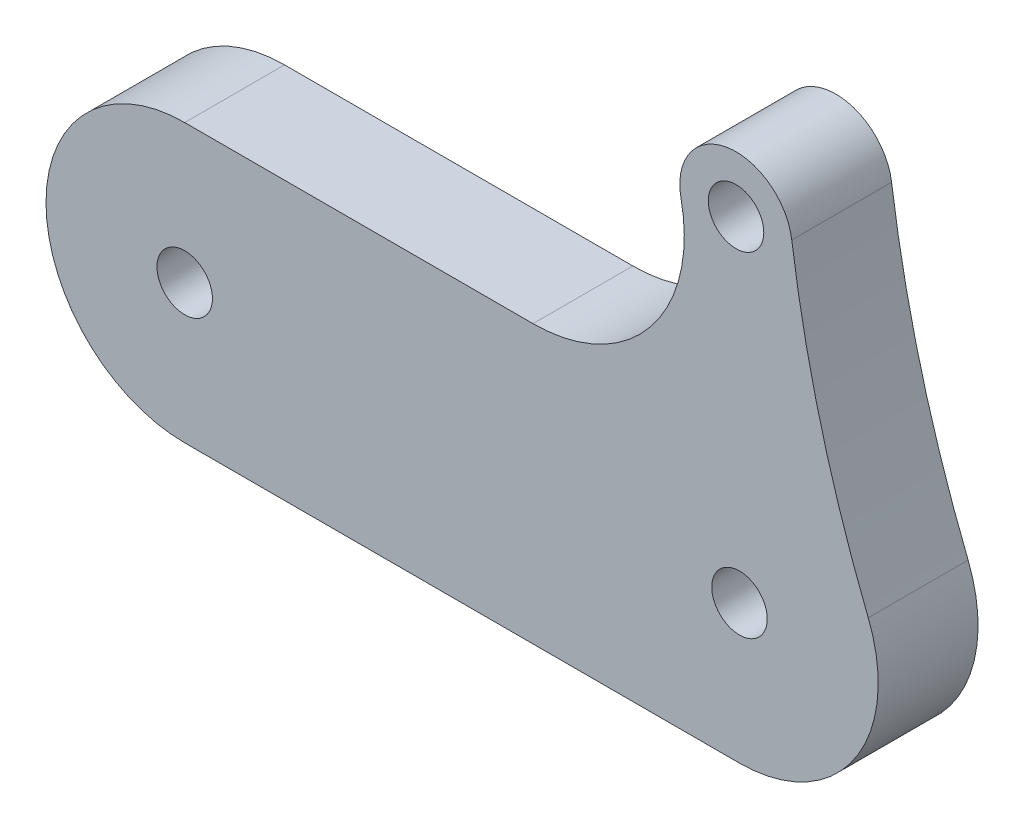
ISO-10303-21;
HEADER;
FILE_DESCRIPTION(('STEP AP214'),'2;1');
FILE_NAME('part.step','',(''),(''),'','','');
FILE_SCHEMA(('AUTOMOTIVE_DESIGN { 1 0 10303 214 1 1 1 1 }'));
ENDSEC;
DATA;
#1=APPLICATION_CONTEXT('core data for automotive mechanical design processes');
#2=APPLICATION_PROTOCOL_DEFINITION('international standard','automotive_design',2000,#1);
#3=PRODUCT_CONTEXT('',#1,'mechanical');
#4=PRODUCT('Part','Part','',(#3));
#5=PRODUCT_RELATED_PRODUCT_CATEGORY('part','',(#4));
#6=PRODUCT_DEFINITION_FORMATION('','',#4);
#7=PRODUCT_DEFINITION_CONTEXT('part definition',#1,'design');
#8=PRODUCT_DEFINITION('design','',#6,#7);
#9=PRODUCT_DEFINITION_SHAPE('','',#8);
#10=(LENGTH_UNIT() NAMED_UNIT(*) SI_UNIT(.MILLI.,.METRE.));
#11=(NAMED_UNIT(*) PLANE_ANGLE_UNIT() SI_UNIT($,.RADIAN.));
#12=(NAMED_UNIT(*) SI_UNIT($,.STERADIAN.) SOLID_ANGLE_UNIT());
#13=UNCERTAINTY_MEASURE_WITH_UNIT(LENGTH_MEASURE(1.E-05),#10,'distance_accuracy_value','');
#14=(GEOMETRIC_REPRESENTATION_CONTEXT(3) GLOBAL_UNCERTAINTY_ASSIGNED_CONTEXT((#13)) GLOBAL_UNIT_ASSIGNED_CONTEXT((#10,
#11,#12)) REPRESENTATION_CONTEXT('',''));
#15=CARTESIAN_POINT('',(0.,0.,0.));
#16=DIRECTION('',(0.,0.,1.));
#17=DIRECTION('',(1.,0.,0.));
#18=AXIS2_PLACEMENT_3D('',#15,#16,#17);
#19=CARTESIAN_POINT('',(0.,0.,3.6));
#20=DIRECTION('',(0.,0.,1.));
#21=DIRECTION('',(1.,0.,0.));
#22=AXIS2_PLACEMENT_3D('',#19,#20,#21);
#23=PLANE('',#22);
#24=CARTESIAN_POINT('',(20.,0.,3.6));
#25=DIRECTION('',(0.,0.,1.));
#26=DIRECTION('',(1.,0.,0.));
#27=AXIS2_PLACEMENT_3D('',#24,#25,#26);
#28=CIRCLE('',#27,1.);
#29=CARTESIAN_POINT('',(21.,0.,3.6));
#30=VERTEX_POINT('',#29);
#31=EDGE_CURVE('E163',#30,#30,#28,.T.);
#32=ORIENTED_EDGE('',*,*,#31,.F.);
#33=EDGE_LOOP('',(#32));
#34=FACE_BOUND('',#33,.T.);
#35=CARTESIAN_POINT('',(0.,0.,3.6));
#36=DIRECTION('',(0.,0.,1.));
#37=DIRECTION('',(1.,0.,0.));
#38=AXIS2_PLACEMENT_3D('',#35,#36,#37);
#39=CIRCLE('',#38,5.);
#40=CARTESIAN_POINT('',(0.,5.,3.6));
#41=VERTEX_POINT('',#40);
#42=CARTESIAN_POINT('',(0.,-5.,3.6));
#43=VERTEX_POINT('',#42);
#44=EDGE_CURVE('E136',#41,#43,#39,.T.);
#45=ORIENTED_EDGE('',*,*,#44,.T.);
#46=DIRECTION('',(1.,0.,0.));
#47=VECTOR('',#46,1.);
#48=CARTESIAN_POINT('',(0.,-5.,3.6));
#49=LINE('',#48,#47);
#50=CARTESIAN_POINT('',(20.,-4.99999999999999,3.6));
#51=VERTEX_POINT('',#50);
#52=EDGE_CURVE('E89',#43,#51,#49,.T.);
#53=ORIENTED_EDGE('',*,*,#52,.T.);
#54=CARTESIAN_POINT('',(20.,0.,3.6));
#55=DIRECTION('',(0.,0.,1.));
#56=DIRECTION('',(1.,0.,0.));
#57=AXIS2_PLACEMENT_3D('',#54,#55,#56);
#58=CIRCLE('',#57,4.99999999999999);
#59=CARTESIAN_POINT('',(24.6411364192931,1.86006793895037,3.6));
#60=VERTEX_POINT('',#59);
#61=EDGE_CURVE('E148',#51,#60,#58,.T.);
#62=ORIENTED_EDGE('',*,*,#61,.T.);
#63=CARTESIAN_POINT('',(65.610052843206,18.2795309861631,3.6));
#64=DIRECTION('',(0.,0.,-1.));
#65=DIRECTION('',(1.,0.,0.));
#66=AXIS2_PLACEMENT_3D('',#63,#64,#65);
#67=CIRCLE('',#66,44.1367293725798);
#68=CARTESIAN_POINT('',(21.883567401075,12.2757529599989,3.6));
#69=VERTEX_POINT('',#68);
#70=EDGE_CURVE('E105',#60,#69,#67,.T.);
#71=ORIENTED_EDGE('',*,*,#70,.T.);
#72=CARTESIAN_POINT('',(19.8752140377203,11.9999999999848,3.6));
#73=DIRECTION('',(0.,0.,1.));
#74=DIRECTION('',(1.,0.,0.));
#75=AXIS2_PLACEMENT_3D('',#72,#73,#74);
#76=CIRCLE('',#75,2.02719582849183);
#77=CARTESIAN_POINT('',(17.8918522278178,11.5807162558749,3.6));
#78=VERTEX_POINT('',#77);
#79=EDGE_CURVE('E99',#69,#78,#76,.T.);
#80=ORIENTED_EDGE('',*,*,#79,.T.);
#81=CARTESIAN_POINT('',(12.5568633524244,10.4528967630869,3.6));
#82=DIRECTION('',(0.,0.,-1.));
#83=DIRECTION('',(1.,0.,0.));
#84=AXIS2_PLACEMENT_3D('',#81,#82,#83);
#85=CIRCLE('',#84,5.45289676308689);
#86=CARTESIAN_POINT('',(12.5568633524244,5.,3.6));
#87=VERTEX_POINT('',#86);
#88=EDGE_CURVE('E103',#78,#87,#85,.T.);
#89=ORIENTED_EDGE('',*,*,#88,.T.);
#90=DIRECTION('',(-1.,0.,0.));
#91=VECTOR('',#90,1.);
#92=CARTESIAN_POINT('',(0.,5.,3.6));
#93=LINE('',#92,#91);
#94=EDGE_CURVE('E49',#87,#41,#93,.T.);
#95=ORIENTED_EDGE('',*,*,#94,.T.);
#96=EDGE_LOOP('',(#45,#53,#62,#71,#80,#89,#95));
#97=FACE_BOUND('',#96,.T.);
#98=CARTESIAN_POINT('',(0.,0.,3.6));
#99=DIRECTION('',(0.,0.,1.));
#100=DIRECTION('',(1.,0.,0.));
#101=AXIS2_PLACEMENT_3D('',#98,#99,#100);
#102=CIRCLE('',#101,1.);
#103=CARTESIAN_POINT('',(1.,0.,3.6));
#104=VERTEX_POINT('',#103);
#105=EDGE_CURVE('E127',#104,#104,#102,.T.);
#106=ORIENTED_EDGE('',*,*,#105,.F.);
#107=EDGE_LOOP('',(#106));
#108=FACE_BOUND('',#107,.T.);
#109=CARTESIAN_POINT('',(19.8752140377203,11.9999999999848,3.6));
#110=DIRECTION('',(0.,0.,1.));
#111=DIRECTION('',(1.,0.,0.));
#112=AXIS2_PLACEMENT_3D('',#109,#110,#111);
#113=CIRCLE('',#112,1.);
#114=CARTESIAN_POINT('',(20.8752140377203,11.9999999999848,3.6));
#115=VERTEX_POINT('',#114);
#116=EDGE_CURVE('E169',#115,#115,#113,.T.);
#117=ORIENTED_EDGE('',*,*,#116,.F.);
#118=EDGE_LOOP('',(#117));
#119=FACE_BOUND('',#118,.T.);
#120=ADVANCED_FACE('F32',(#34,#97,#108,#119),#23,.T.);
#121=CARTESIAN_POINT('',(0.,0.,0.));
#122=DIRECTION('',(0.,0.,1.));
#123=DIRECTION('',(1.,0.,0.));
#124=AXIS2_PLACEMENT_3D('',#121,#122,#123);
#125=PLANE('',#124);
#126=CARTESIAN_POINT('',(0.,0.,0.));
#127=DIRECTION('',(0.,0.,1.));
#128=DIRECTION('',(1.,0.,0.));
#129=AXIS2_PLACEMENT_3D('',#126,#127,#128);
#130=CIRCLE('',#129,5.);
#131=CARTESIAN_POINT('',(0.,5.,0.));
#132=VERTEX_POINT('',#131);
#133=CARTESIAN_POINT('',(0.,-5.,0.));
#134=VERTEX_POINT('',#133);
#135=EDGE_CURVE('E123',#132,#134,#130,.T.);
#136=ORIENTED_EDGE('',*,*,#135,.F.);
#137=DIRECTION('',(-1.,0.,0.));
#138=VECTOR('',#137,1.);
#139=CARTESIAN_POINT('',(0.,5.,0.));
#140=LINE('',#139,#138);
#141=CARTESIAN_POINT('',(12.5568633524244,5.,0.));
#142=VERTEX_POINT('',#141);
#143=EDGE_CURVE('E81',#142,#132,#140,.T.);
#144=ORIENTED_EDGE('',*,*,#143,.F.);
#145=CARTESIAN_POINT('',(12.5568633524244,10.4528967630869,0.));
#146=DIRECTION('',(0.,0.,-1.));
#147=DIRECTION('',(1.,0.,0.));
#148=AXIS2_PLACEMENT_3D('',#145,#146,#147);
#149=CIRCLE('',#148,5.45289676308689);
#150=CARTESIAN_POINT('',(17.8918522278178,11.5807162558749,0.));
#151=VERTEX_POINT('',#150);
#152=EDGE_CURVE('E75',#151,#142,#149,.T.);
#153=ORIENTED_EDGE('',*,*,#152,.F.);
#154=CARTESIAN_POINT('',(19.8752140377203,11.9999999999848,0.));
#155=DIRECTION('',(0.,0.,1.));
#156=DIRECTION('',(1.,0.,0.));
#157=AXIS2_PLACEMENT_3D('',#154,#155,#156);
#158=CIRCLE('',#157,2.02719582849183);
#159=CARTESIAN_POINT('',(21.883567401075,12.2757529599989,0.));
#160=VERTEX_POINT('',#159);
#161=EDGE_CURVE('E113',#160,#151,#158,.T.);
#162=ORIENTED_EDGE('',*,*,#161,.F.);
#163=CARTESIAN_POINT('',(65.610052843206,18.2795309861631,0.));
#164=DIRECTION('',(0.,0.,-1.));
#165=DIRECTION('',(1.,0.,0.));
#166=AXIS2_PLACEMENT_3D('',#163,#164,#165);
#167=CIRCLE('',#166,44.1367293725798);
#168=CARTESIAN_POINT('',(24.6411364192931,1.86006793895037,0.));
#169=VERTEX_POINT('',#168);
#170=EDGE_CURVE('E131',#169,#160,#167,.T.);
#171=ORIENTED_EDGE('',*,*,#170,.F.);
#172=CARTESIAN_POINT('',(20.,0.,0.));
#173=DIRECTION('',(0.,0.,1.));
#174=DIRECTION('',(1.,0.,0.));
#175=AXIS2_PLACEMENT_3D('',#172,#173,#174);
#176=CIRCLE('',#175,4.99999999999999);
#177=CARTESIAN_POINT('',(20.,-4.99999999999999,0.));
#178=VERTEX_POINT('',#177);
#179=EDGE_CURVE('E129',#178,#169,#176,.T.);
#180=ORIENTED_EDGE('',*,*,#179,.F.);
#181=DIRECTION('',(1.,0.,0.));
#182=VECTOR('',#181,1.);
#183=CARTESIAN_POINT('',(0.,-5.,0.));
#184=LINE('',#183,#182);
#185=EDGE_CURVE('E126',#134,#178,#184,.T.);
#186=ORIENTED_EDGE('',*,*,#185,.F.);
#187=EDGE_LOOP('',(#136,#144,#153,#162,#171,#180,#186));
#188=FACE_BOUND('',#187,.T.);
#189=CARTESIAN_POINT('',(0.,0.,0.));
#190=DIRECTION('',(0.,0.,1.));
#191=DIRECTION('',(1.,0.,0.));
#192=AXIS2_PLACEMENT_3D('',#189,#190,#191);
#193=CIRCLE('',#192,1.);
#194=CARTESIAN_POINT('',(1.,0.,0.));
#195=VERTEX_POINT('',#194);
#196=EDGE_CURVE('E160',#195,#195,#193,.T.);
#197=ORIENTED_EDGE('',*,*,#196,.T.);
#198=EDGE_LOOP('',(#197));
#199=FACE_BOUND('',#198,.T.);
#200=CARTESIAN_POINT('',(20.,0.,0.));
#201=DIRECTION('',(0.,0.,1.));
#202=DIRECTION('',(1.,0.,0.));
#203=AXIS2_PLACEMENT_3D('',#200,#201,#202);
#204=CIRCLE('',#203,1.);
#205=CARTESIAN_POINT('',(21.,0.,0.));
#206=VERTEX_POINT('',#205);
#207=EDGE_CURVE('E166',#206,#206,#204,.T.);
#208=ORIENTED_EDGE('',*,*,#207,.T.);
#209=EDGE_LOOP('',(#208));
#210=FACE_BOUND('',#209,.T.);
#211=CARTESIAN_POINT('',(19.8752140377203,11.9999999999848,0.));
#212=DIRECTION('',(0.,0.,1.));
#213=DIRECTION('',(1.,0.,0.));
#214=AXIS2_PLACEMENT_3D('',#211,#212,#213);
#215=CIRCLE('',#214,1.);
#216=CARTESIAN_POINT('',(20.8752140377203,11.9999999999848,0.));
#217=VERTEX_POINT('',#216);
#218=EDGE_CURVE('E172',#217,#217,#215,.T.);
#219=ORIENTED_EDGE('',*,*,#218,.T.);
#220=EDGE_LOOP('',(#219));
#221=FACE_BOUND('',#220,.T.);
#222=ADVANCED_FACE('F152',(#188,#199,#210,#221),#125,.F.);
#223=CARTESIAN_POINT('',(0.,0.,3.6));
#224=DIRECTION('',(0.,0.,-1.));
#225=DIRECTION('',(-1.,0.,0.));
#226=AXIS2_PLACEMENT_3D('',#223,#224,#225);
#227=CYLINDRICAL_SURFACE('',#226,5.);
#228=ORIENTED_EDGE('',*,*,#135,.T.);
#229=DIRECTION('',(0.,0.,-1.));
#230=VECTOR('',#229,1.);
#231=CARTESIAN_POINT('',(0.,-5.,3.6));
#232=LINE('',#231,#230);
#233=EDGE_CURVE('E11',#43,#134,#232,.T.);
#234=ORIENTED_EDGE('',*,*,#233,.F.);
#235=ORIENTED_EDGE('',*,*,#44,.F.);
#236=DIRECTION('',(0.,0.,-1.));
#237=VECTOR('',#236,1.);
#238=CARTESIAN_POINT('',(0.,5.,3.6));
#239=LINE('',#238,#237);
#240=EDGE_CURVE('E119',#41,#132,#239,.T.);
#241=ORIENTED_EDGE('',*,*,#240,.T.);
#242=EDGE_LOOP('',(#228,#234,#235,#241));
#243=FACE_BOUND('',#242,.T.);
#244=ADVANCED_FACE('F34',(#243),#227,.T.);
#245=CARTESIAN_POINT('',(0.,-5.,3.6));
#246=DIRECTION('',(0.,1.,0.));
#247=DIRECTION('',(-1.,0.,0.));
#248=AXIS2_PLACEMENT_3D('',#245,#246,#247);
#249=PLANE('',#248);
#250=ORIENTED_EDGE('',*,*,#185,.T.);
#251=DIRECTION('',(0.,0.,-1.));
#252=VECTOR('',#251,1.);
#253=CARTESIAN_POINT('',(20.,-4.99999999999999,3.6));
#254=LINE('',#253,#252);
#255=EDGE_CURVE('E41',#51,#178,#254,.T.);
#256=ORIENTED_EDGE('',*,*,#255,.F.);
#257=ORIENTED_EDGE('',*,*,#52,.F.);
#258=ORIENTED_EDGE('',*,*,#233,.T.);
#259=EDGE_LOOP('',(#250,#256,#257,#258));
#260=FACE_BOUND('',#259,.T.);
#261=ADVANCED_FACE('F203',(#260),#249,.F.);
#262=CARTESIAN_POINT('',(20.,0.,3.6));
#263=DIRECTION('',(0.,0.,-1.));
#264=DIRECTION('',(-1.,0.,0.));
#265=AXIS2_PLACEMENT_3D('',#262,#263,#264);
#266=CYLINDRICAL_SURFACE('',#265,4.99999999999999);
#267=ORIENTED_EDGE('',*,*,#179,.T.);
#268=DIRECTION('',(0.,0.,-1.));
#269=VECTOR('',#268,1.);
#270=CARTESIAN_POINT('',(24.6411364192931,1.86006793895037,3.6));
#271=LINE('',#270,#269);
#272=EDGE_CURVE('E140',#60,#169,#271,.T.);
#273=ORIENTED_EDGE('',*,*,#272,.F.);
#274=ORIENTED_EDGE('',*,*,#61,.F.);
#275=ORIENTED_EDGE('',*,*,#255,.T.);
#276=EDGE_LOOP('',(#267,#273,#274,#275));
#277=FACE_BOUND('',#276,.T.);
#278=ADVANCED_FACE('F146',(#277),#266,.T.);
#279=CARTESIAN_POINT('',(65.610052843206,18.2795309861631,3.6));
#280=DIRECTION('',(0.,0.,-1.));
#281=DIRECTION('',(-1.,0.,0.));
#282=AXIS2_PLACEMENT_3D('',#279,#280,#281);
#283=CYLINDRICAL_SURFACE('',#282,44.1367293725798);
#284=ORIENTED_EDGE('',*,*,#170,.T.);
#285=DIRECTION('',(0.,0.,-1.));
#286=VECTOR('',#285,1.);
#287=CARTESIAN_POINT('',(21.883567401075,12.2757529599989,3.6));
#288=LINE('',#287,#286);
#289=EDGE_CURVE('E114',#69,#160,#288,.T.);
#290=ORIENTED_EDGE('',*,*,#289,.F.);
#291=ORIENTED_EDGE('',*,*,#70,.F.);
#292=ORIENTED_EDGE('',*,*,#272,.T.);
#293=EDGE_LOOP('',(#284,#290,#291,#292));
#294=FACE_BOUND('',#293,.T.);
#295=ADVANCED_FACE('F155',(#294),#283,.F.);
#296=CARTESIAN_POINT('',(19.8752140377203,11.9999999999848,3.6));
#297=DIRECTION('',(0.,0.,-1.));
#298=DIRECTION('',(-1.,0.,0.));
#299=AXIS2_PLACEMENT_3D('',#296,#297,#298);
#300=CYLINDRICAL_SURFACE('',#299,2.02719582849183);
#301=ORIENTED_EDGE('',*,*,#161,.T.);
#302=DIRECTION('',(0.,0.,-1.));
#303=VECTOR('',#302,1.);
#304=CARTESIAN_POINT('',(17.8918522278178,11.5807162558749,3.6));
#305=LINE('',#304,#303);
#306=EDGE_CURVE('E110',#78,#151,#305,.T.);
#307=ORIENTED_EDGE('',*,*,#306,.F.);
#308=ORIENTED_EDGE('',*,*,#79,.F.);
#309=ORIENTED_EDGE('',*,*,#289,.T.);
#310=EDGE_LOOP('',(#301,#307,#308,#309));
#311=FACE_BOUND('',#310,.T.);
#312=ADVANCED_FACE('F111',(#311),#300,.T.);
#313=CARTESIAN_POINT('',(12.5568633524244,10.4528967630869,3.6));
#314=DIRECTION('',(0.,0.,-1.));
#315=DIRECTION('',(-1.,0.,0.));
#316=AXIS2_PLACEMENT_3D('',#313,#314,#315);
#317=CYLINDRICAL_SURFACE('',#316,5.45289676308689);
#318=ORIENTED_EDGE('',*,*,#152,.T.);
#319=DIRECTION('',(0.,0.,-1.));
#320=VECTOR('',#319,1.);
#321=CARTESIAN_POINT('',(12.5568633524244,5.,3.6));
#322=LINE('',#321,#320);
#323=EDGE_CURVE('E115',#87,#142,#322,.T.);
#324=ORIENTED_EDGE('',*,*,#323,.F.);
#325=ORIENTED_EDGE('',*,*,#88,.F.);
#326=ORIENTED_EDGE('',*,*,#306,.T.);
#327=EDGE_LOOP('',(#318,#324,#325,#326));
#328=FACE_BOUND('',#327,.T.);
#329=ADVANCED_FACE('F117',(#328),#317,.F.);
#330=CARTESIAN_POINT('',(0.,5.,3.6));
#331=DIRECTION('',(0.,-1.,0.));
#332=DIRECTION('',(0.,0.,-1.));
#333=AXIS2_PLACEMENT_3D('',#330,#331,#332);
#334=PLANE('',#333);
#335=ORIENTED_EDGE('',*,*,#143,.T.);
#336=ORIENTED_EDGE('',*,*,#240,.F.);
#337=ORIENTED_EDGE('',*,*,#94,.F.);
#338=ORIENTED_EDGE('',*,*,#323,.T.);
#339=EDGE_LOOP('',(#335,#336,#337,#338));
#340=FACE_BOUND('',#339,.T.);
#341=ADVANCED_FACE('F193',(#340),#334,.F.);
#342=CARTESIAN_POINT('',(0.,0.,3.6));
#343=DIRECTION('',(0.,0.,-1.));
#344=DIRECTION('',(-1.,0.,0.));
#345=AXIS2_PLACEMENT_3D('',#342,#343,#344);
#346=CYLINDRICAL_SURFACE('',#345,1.);
#347=ORIENTED_EDGE('',*,*,#105,.T.);
#348=EDGE_LOOP('',(#347));
#349=FACE_BOUND('',#348,.T.);
#350=ORIENTED_EDGE('',*,*,#196,.F.);
#351=EDGE_LOOP('',(#350));
#352=FACE_BOUND('',#351,.T.);
#353=ADVANCED_FACE('F190',(#349,#352),#346,.F.);
#354=CARTESIAN_POINT('',(20.,0.,3.6));
#355=DIRECTION('',(0.,0.,-1.));
#356=DIRECTION('',(-1.,0.,0.));
#357=AXIS2_PLACEMENT_3D('',#354,#355,#356);
#358=CYLINDRICAL_SURFACE('',#357,1.);
#359=ORIENTED_EDGE('',*,*,#31,.T.);
#360=EDGE_LOOP('',(#359));
#361=FACE_BOUND('',#360,.T.);
#362=ORIENTED_EDGE('',*,*,#207,.F.);
#363=EDGE_LOOP('',(#362));
#364=FACE_BOUND('',#363,.T.);
#365=ADVANCED_FACE('F262',(#361,#364),#358,.F.);
#366=CARTESIAN_POINT('',(19.8752140377203,11.9999999999848,3.6));
#367=DIRECTION('',(0.,0.,-1.));
#368=DIRECTION('',(-1.,0.,0.));
#369=AXIS2_PLACEMENT_3D('',#366,#367,#368);
#370=CYLINDRICAL_SURFACE('',#369,1.);
#371=ORIENTED_EDGE('',*,*,#116,.T.);
#372=EDGE_LOOP('',(#371));
#373=FACE_BOUND('',#372,.T.);
#374=ORIENTED_EDGE('',*,*,#218,.F.);
#375=EDGE_LOOP('',(#374));
#376=FACE_BOUND('',#375,.T.);
#377=ADVANCED_FACE('F178',(#373,#376),#370,.F.);
#378=CLOSED_SHELL('',(#120,#222,#244,#261,#278,#295,#312,#329,#341,#353,#365,#377));
#379=MANIFOLD_SOLID_BREP('B2',#378);
#380=ADVANCED_BREP_SHAPE_REPRESENTATION('',(#18,#379),#14);
#381=SHAPE_DEFINITION_REPRESENTATION(#9,#380);
ENDSEC;
END-ISO-10303-21;
